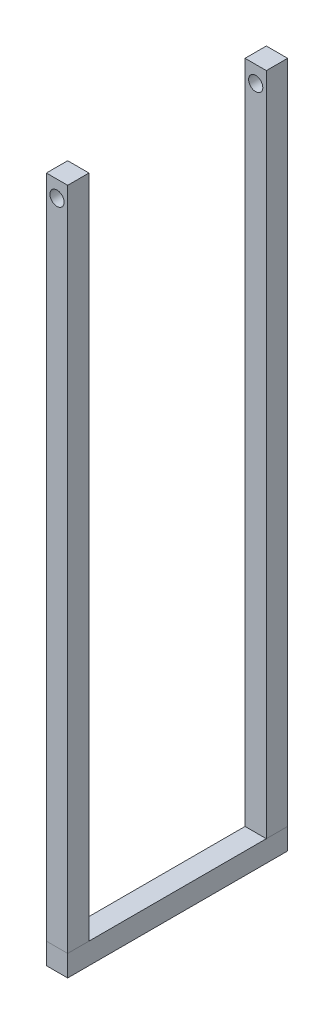
ISO-10303-21;
HEADER;
FILE_DESCRIPTION(('STEP AP214'),'2;1');
FILE_NAME('part.step','',(''),(''),'','','');
FILE_SCHEMA(('AUTOMOTIVE_DESIGN { 1 0 10303 214 1 1 1 1 }'));
ENDSEC;
DATA;
#1=APPLICATION_CONTEXT('core data for automotive mechanical design processes');
#2=APPLICATION_PROTOCOL_DEFINITION('international standard','automotive_design',2000,#1);
#3=PRODUCT_CONTEXT('',#1,'mechanical');
#4=PRODUCT('Part','Part','',(#3));
#5=PRODUCT_RELATED_PRODUCT_CATEGORY('part','',(#4));
#6=PRODUCT_DEFINITION_FORMATION('','',#4);
#7=PRODUCT_DEFINITION_CONTEXT('part definition',#1,'design');
#8=PRODUCT_DEFINITION('design','',#6,#7);
#9=PRODUCT_DEFINITION_SHAPE('','',#8);
#10=(LENGTH_UNIT() NAMED_UNIT(*) SI_UNIT(.MILLI.,.METRE.));
#11=(NAMED_UNIT(*) PLANE_ANGLE_UNIT() SI_UNIT($,.RADIAN.));
#12=(NAMED_UNIT(*) SI_UNIT($,.STERADIAN.) SOLID_ANGLE_UNIT());
#13=UNCERTAINTY_MEASURE_WITH_UNIT(LENGTH_MEASURE(1.E-05),#10,'distance_accuracy_value','');
#14=(GEOMETRIC_REPRESENTATION_CONTEXT(3) GLOBAL_UNCERTAINTY_ASSIGNED_CONTEXT((#13)) GLOBAL_UNIT_ASSIGNED_CONTEXT((#10,
#11,#12)) REPRESENTATION_CONTEXT('',''));
#15=CARTESIAN_POINT('',(0.,0.,0.));
#16=DIRECTION('',(0.,0.,1.));
#17=DIRECTION('',(1.,0.,0.));
#18=AXIS2_PLACEMENT_3D('',#15,#16,#17);
#19=CARTESIAN_POINT('',(6.,375.,118.));
#20=DIRECTION('',(-1.,0.,0.));
#21=DIRECTION('',(0.,0.,1.));
#22=AXIS2_PLACEMENT_3D('',#19,#20,#21);
#23=PLANE('',#22);
#24=DIRECTION('',(0.,0.,-1.));
#25=VECTOR('',#24,1.);
#26=CARTESIAN_POINT('',(6.,0.,118.));
#27=LINE('',#26,#25);
#28=CARTESIAN_POINT('',(6.,0.,118.));
#29=VERTEX_POINT('',#28);
#30=CARTESIAN_POINT('',(6.,0.,106.));
#31=VERTEX_POINT('',#30);
#32=EDGE_CURVE('E108',#29,#31,#27,.T.);
#33=ORIENTED_EDGE('',*,*,#32,.T.);
#34=DIRECTION('',(0.,-1.,0.));
#35=VECTOR('',#34,1.);
#36=CARTESIAN_POINT('',(6.,375.,106.));
#37=LINE('',#36,#35);
#38=CARTESIAN_POINT('',(6.,375.,106.));
#39=VERTEX_POINT('',#38);
#40=EDGE_CURVE('E12',#39,#31,#37,.T.);
#41=ORIENTED_EDGE('',*,*,#40,.F.);
#42=DIRECTION('',(0.,0.,-1.));
#43=VECTOR('',#42,1.);
#44=CARTESIAN_POINT('',(6.,375.,118.));
#45=LINE('',#44,#43);
#46=CARTESIAN_POINT('',(6.,375.,118.));
#47=VERTEX_POINT('',#46);
#48=EDGE_CURVE('E96',#47,#39,#45,.T.);
#49=ORIENTED_EDGE('',*,*,#48,.F.);
#50=DIRECTION('',(0.,-1.,0.));
#51=VECTOR('',#50,1.);
#52=CARTESIAN_POINT('',(6.,375.,118.));
#53=LINE('',#52,#51);
#54=EDGE_CURVE('E104',#47,#29,#53,.T.);
#55=ORIENTED_EDGE('',*,*,#54,.T.);
#56=EDGE_LOOP('',(#33,#41,#49,#55));
#57=FACE_BOUND('',#56,.T.);
#58=ADVANCED_FACE('F45',(#57),#23,.F.);
#59=CARTESIAN_POINT('',(6.,375.,106.));
#60=DIRECTION('',(0.,0.,1.));
#61=DIRECTION('',(1.,0.,0.));
#62=AXIS2_PLACEMENT_3D('',#59,#60,#61);
#63=PLANE('',#62);
#64=CARTESIAN_POINT('',(0.,365.684639754162,106.));
#65=DIRECTION('',(0.,0.,1.));
#66=DIRECTION('',(1.,0.,0.));
#67=AXIS2_PLACEMENT_3D('',#64,#65,#66);
#68=CIRCLE('',#67,4.00000000000001);
#69=CARTESIAN_POINT('',(4.00000000000001,365.684639754162,106.));
#70=VERTEX_POINT('',#69);
#71=EDGE_CURVE('E111',#70,#70,#68,.T.);
#72=ORIENTED_EDGE('',*,*,#71,.T.);
#73=EDGE_LOOP('',(#72));
#74=FACE_BOUND('',#73,.T.);
#75=DIRECTION('',(-1.,0.,0.));
#76=VECTOR('',#75,1.);
#77=CARTESIAN_POINT('',(6.,0.,106.));
#78=LINE('',#77,#76);
#79=CARTESIAN_POINT('',(-6.,0.,106.));
#80=VERTEX_POINT('',#79);
#81=EDGE_CURVE('E100',#31,#80,#78,.T.);
#82=ORIENTED_EDGE('',*,*,#81,.T.);
#83=DIRECTION('',(0.,-1.,0.));
#84=VECTOR('',#83,1.);
#85=CARTESIAN_POINT('',(-6.,375.,106.));
#86=LINE('',#85,#84);
#87=CARTESIAN_POINT('',(-6.,375.,106.));
#88=VERTEX_POINT('',#87);
#89=EDGE_CURVE('E53',#88,#80,#86,.T.);
#90=ORIENTED_EDGE('',*,*,#89,.F.);
#91=DIRECTION('',(-1.,0.,0.));
#92=VECTOR('',#91,1.);
#93=CARTESIAN_POINT('',(6.,375.,106.));
#94=LINE('',#93,#92);
#95=EDGE_CURVE('E91',#39,#88,#94,.T.);
#96=ORIENTED_EDGE('',*,*,#95,.F.);
#97=ORIENTED_EDGE('',*,*,#40,.T.);
#98=EDGE_LOOP('',(#82,#90,#96,#97));
#99=FACE_BOUND('',#98,.T.);
#100=ADVANCED_FACE('F99',(#74,#99),#63,.F.);
#101=CARTESIAN_POINT('',(-6.,375.,118.));
#102=DIRECTION('',(1.,0.,0.));
#103=DIRECTION('',(0.,0.,-1.));
#104=AXIS2_PLACEMENT_3D('',#101,#102,#103);
#105=PLANE('',#104);
#106=DIRECTION('',(0.,0.,1.));
#107=VECTOR('',#106,1.);
#108=CARTESIAN_POINT('',(-6.,0.,118.));
#109=LINE('',#108,#107);
#110=CARTESIAN_POINT('',(-6.,0.,118.));
#111=VERTEX_POINT('',#110);
#112=EDGE_CURVE('E78',#80,#111,#109,.T.);
#113=ORIENTED_EDGE('',*,*,#112,.T.);
#114=DIRECTION('',(0.,-1.,0.));
#115=VECTOR('',#114,1.);
#116=CARTESIAN_POINT('',(-6.,375.,118.));
#117=LINE('',#116,#115);
#118=CARTESIAN_POINT('',(-6.,375.,118.));
#119=VERTEX_POINT('',#118);
#120=EDGE_CURVE('E101',#119,#111,#117,.T.);
#121=ORIENTED_EDGE('',*,*,#120,.F.);
#122=DIRECTION('',(0.,0.,1.));
#123=VECTOR('',#122,1.);
#124=CARTESIAN_POINT('',(-6.,375.,118.));
#125=LINE('',#124,#123);
#126=EDGE_CURVE('E94',#88,#119,#125,.T.);
#127=ORIENTED_EDGE('',*,*,#126,.F.);
#128=ORIENTED_EDGE('',*,*,#89,.T.);
#129=EDGE_LOOP('',(#113,#121,#127,#128));
#130=FACE_BOUND('',#129,.T.);
#131=ADVANCED_FACE('F102',(#130),#105,.F.);
#132=CARTESIAN_POINT('',(6.,375.,118.));
#133=DIRECTION('',(0.,0.,-1.));
#134=DIRECTION('',(-1.,0.,0.));
#135=AXIS2_PLACEMENT_3D('',#132,#133,#134);
#136=PLANE('',#135);
#137=CARTESIAN_POINT('',(0.,365.684639754162,118.));
#138=DIRECTION('',(0.,0.,1.));
#139=DIRECTION('',(1.,0.,0.));
#140=AXIS2_PLACEMENT_3D('',#137,#138,#139);
#141=CIRCLE('',#140,4.00000000000001);
#142=CARTESIAN_POINT('',(4.00000000000001,365.684639754162,118.));
#143=VERTEX_POINT('',#142);
#144=EDGE_CURVE('E124',#143,#143,#141,.T.);
#145=ORIENTED_EDGE('',*,*,#144,.F.);
#146=EDGE_LOOP('',(#145));
#147=FACE_BOUND('',#146,.T.);
#148=DIRECTION('',(1.,0.,0.));
#149=VECTOR('',#148,1.);
#150=CARTESIAN_POINT('',(6.,0.,118.));
#151=LINE('',#150,#149);
#152=EDGE_CURVE('E84',#111,#29,#151,.T.);
#153=ORIENTED_EDGE('',*,*,#152,.T.);
#154=ORIENTED_EDGE('',*,*,#54,.F.);
#155=DIRECTION('',(1.,0.,0.));
#156=VECTOR('',#155,1.);
#157=CARTESIAN_POINT('',(6.,375.,118.));
#158=LINE('',#157,#156);
#159=EDGE_CURVE('E61',#119,#47,#158,.T.);
#160=ORIENTED_EDGE('',*,*,#159,.F.);
#161=ORIENTED_EDGE('',*,*,#120,.T.);
#162=EDGE_LOOP('',(#153,#154,#160,#161));
#163=FACE_BOUND('',#162,.T.);
#164=ADVANCED_FACE('F116',(#147,#163),#136,.F.);
#165=CARTESIAN_POINT('',(0.,375.,0.));
#166=DIRECTION('',(0.,1.,0.));
#167=DIRECTION('',(0.,0.,1.));
#168=AXIS2_PLACEMENT_3D('',#165,#166,#167);
#169=PLANE('',#168);
#170=ORIENTED_EDGE('',*,*,#48,.T.);
#171=ORIENTED_EDGE('',*,*,#95,.T.);
#172=ORIENTED_EDGE('',*,*,#126,.T.);
#173=ORIENTED_EDGE('',*,*,#159,.T.);
#174=EDGE_LOOP('',(#170,#171,#172,#173));
#175=FACE_BOUND('',#174,.T.);
#176=ADVANCED_FACE('F92',(#175),#169,.T.);
#177=CARTESIAN_POINT('',(0.,0.,0.));
#178=DIRECTION('',(0.,1.,0.));
#179=DIRECTION('',(0.,0.,1.));
#180=AXIS2_PLACEMENT_3D('',#177,#178,#179);
#181=PLANE('',#180);
#182=ORIENTED_EDGE('',*,*,#32,.F.);
#183=ORIENTED_EDGE('',*,*,#152,.F.);
#184=ORIENTED_EDGE('',*,*,#112,.F.);
#185=ORIENTED_EDGE('',*,*,#81,.F.);
#186=EDGE_LOOP('',(#182,#183,#184,#185));
#187=FACE_BOUND('',#186,.T.);
#188=ADVANCED_FACE('F119',(#187),#181,.F.);
#189=CARTESIAN_POINT('',(0.,365.684639754162,-6.));
#190=DIRECTION('',(0.,0.,1.));
#191=DIRECTION('',(1.,0.,0.));
#192=AXIS2_PLACEMENT_3D('',#189,#190,#191);
#193=CYLINDRICAL_SURFACE('',#192,4.00000000000001);
#194=ORIENTED_EDGE('',*,*,#144,.T.);
#195=EDGE_LOOP('',(#194));
#196=FACE_BOUND('',#195,.T.);
#197=ORIENTED_EDGE('',*,*,#71,.F.);
#198=EDGE_LOOP('',(#197));
#199=FACE_BOUND('',#198,.T.);
#200=ADVANCED_FACE('F128',(#196,#199),#193,.F.);
#201=CLOSED_SHELL('',(#58,#100,#131,#164,#176,#188,#200));
#202=MANIFOLD_SOLID_BREP('B2',#201);
#203=CARTESIAN_POINT('',(6.,0.,118.));
#204=DIRECTION('',(1.,0.,0.));
#205=DIRECTION('',(0.,1.,0.));
#206=AXIS2_PLACEMENT_3D('',#203,#204,#205);
#207=PLANE('',#206);
#208=DIRECTION('',(0.,-1.,0.));
#209=VECTOR('',#208,1.);
#210=CARTESIAN_POINT('',(6.,0.,-6.));
#211=LINE('',#210,#209);
#212=CARTESIAN_POINT('',(6.,0.,-6.));
#213=VERTEX_POINT('',#212);
#214=CARTESIAN_POINT('',(6.,-12.,-6.));
#215=VERTEX_POINT('',#214);
#216=EDGE_CURVE('E262',#213,#215,#211,.T.);
#217=ORIENTED_EDGE('',*,*,#216,.F.);
#218=DIRECTION('',(0.,0.,-1.));
#219=VECTOR('',#218,1.);
#220=CARTESIAN_POINT('',(6.,0.,118.));
#221=LINE('',#220,#219);
#222=CARTESIAN_POINT('',(6.,0.,118.));
#223=VERTEX_POINT('',#222);
#224=EDGE_CURVE('E43',#223,#213,#221,.T.);
#225=ORIENTED_EDGE('',*,*,#224,.F.);
#226=DIRECTION('',(0.,-1.,0.));
#227=VECTOR('',#226,1.);
#228=CARTESIAN_POINT('',(6.,0.,118.));
#229=LINE('',#228,#227);
#230=CARTESIAN_POINT('',(6.,-12.,118.));
#231=VERTEX_POINT('',#230);
#232=EDGE_CURVE('E256',#223,#231,#229,.T.);
#233=ORIENTED_EDGE('',*,*,#232,.T.);
#234=DIRECTION('',(0.,0.,-1.));
#235=VECTOR('',#234,1.);
#236=CARTESIAN_POINT('',(6.,-12.,118.));
#237=LINE('',#236,#235);
#238=EDGE_CURVE('E201',#231,#215,#237,.T.);
#239=ORIENTED_EDGE('',*,*,#238,.T.);
#240=EDGE_LOOP('',(#217,#225,#233,#239));
#241=FACE_BOUND('',#240,.T.);
#242=ADVANCED_FACE('F198',(#241),#207,.T.);
#243=CARTESIAN_POINT('',(6.,0.,118.));
#244=DIRECTION('',(0.,1.,0.));
#245=DIRECTION('',(0.,0.,1.));
#246=AXIS2_PLACEMENT_3D('',#243,#244,#245);
#247=PLANE('',#246);
#248=DIRECTION('',(1.,0.,0.));
#249=VECTOR('',#248,1.);
#250=CARTESIAN_POINT('',(6.,0.,-6.));
#251=LINE('',#250,#249);
#252=CARTESIAN_POINT('',(-6.,0.,-6.));
#253=VERTEX_POINT('',#252);
#254=EDGE_CURVE('E258',#253,#213,#251,.T.);
#255=ORIENTED_EDGE('',*,*,#254,.F.);
#256=DIRECTION('',(0.,0.,-1.));
#257=VECTOR('',#256,1.);
#258=CARTESIAN_POINT('',(-6.,0.,118.));
#259=LINE('',#258,#257);
#260=CARTESIAN_POINT('',(-6.,0.,118.));
#261=VERTEX_POINT('',#260);
#262=EDGE_CURVE('E207',#261,#253,#259,.T.);
#263=ORIENTED_EDGE('',*,*,#262,.F.);
#264=DIRECTION('',(1.,0.,0.));
#265=VECTOR('',#264,1.);
#266=CARTESIAN_POINT('',(6.,0.,118.));
#267=LINE('',#266,#265);
#268=EDGE_CURVE('E253',#261,#223,#267,.T.);
#269=ORIENTED_EDGE('',*,*,#268,.T.);
#270=ORIENTED_EDGE('',*,*,#224,.T.);
#271=EDGE_LOOP('',(#255,#263,#269,#270));
#272=FACE_BOUND('',#271,.T.);
#273=ADVANCED_FACE('F272',(#272),#247,.T.);
#274=CARTESIAN_POINT('',(-6.,0.,118.));
#275=DIRECTION('',(-1.,0.,0.));
#276=DIRECTION('',(0.,-1.,0.));
#277=AXIS2_PLACEMENT_3D('',#274,#275,#276);
#278=PLANE('',#277);
#279=DIRECTION('',(0.,1.,0.));
#280=VECTOR('',#279,1.);
#281=CARTESIAN_POINT('',(-6.,0.,-6.));
#282=LINE('',#281,#280);
#283=CARTESIAN_POINT('',(-6.,-12.,-6.));
#284=VERTEX_POINT('',#283);
#285=EDGE_CURVE('E248',#284,#253,#282,.T.);
#286=ORIENTED_EDGE('',*,*,#285,.F.);
#287=DIRECTION('',(0.,0.,-1.));
#288=VECTOR('',#287,1.);
#289=CARTESIAN_POINT('',(-6.,-12.,118.));
#290=LINE('',#289,#288);
#291=CARTESIAN_POINT('',(-6.,-12.,118.));
#292=VERTEX_POINT('',#291);
#293=EDGE_CURVE('E243',#292,#284,#290,.T.);
#294=ORIENTED_EDGE('',*,*,#293,.F.);
#295=DIRECTION('',(0.,1.,0.));
#296=VECTOR('',#295,1.);
#297=CARTESIAN_POINT('',(-6.,0.,118.));
#298=LINE('',#297,#296);
#299=EDGE_CURVE('E246',#292,#261,#298,.T.);
#300=ORIENTED_EDGE('',*,*,#299,.T.);
#301=ORIENTED_EDGE('',*,*,#262,.T.);
#302=EDGE_LOOP('',(#286,#294,#300,#301));
#303=FACE_BOUND('',#302,.T.);
#304=ADVANCED_FACE('F245',(#303),#278,.T.);
#305=CARTESIAN_POINT('',(6.,-12.,118.));
#306=DIRECTION('',(0.,-1.,0.));
#307=DIRECTION('',(0.,0.,-1.));
#308=AXIS2_PLACEMENT_3D('',#305,#306,#307);
#309=PLANE('',#308);
#310=DIRECTION('',(-1.,0.,0.));
#311=VECTOR('',#310,1.);
#312=CARTESIAN_POINT('',(6.,-12.,-6.));
#313=LINE('',#312,#311);
#314=EDGE_CURVE('E265',#215,#284,#313,.T.);
#315=ORIENTED_EDGE('',*,*,#314,.F.);
#316=ORIENTED_EDGE('',*,*,#238,.F.);
#317=DIRECTION('',(-1.,0.,0.));
#318=VECTOR('',#317,1.);
#319=CARTESIAN_POINT('',(6.,-12.,118.));
#320=LINE('',#319,#318);
#321=EDGE_CURVE('E252',#231,#292,#320,.T.);
#322=ORIENTED_EDGE('',*,*,#321,.T.);
#323=ORIENTED_EDGE('',*,*,#293,.T.);
#324=EDGE_LOOP('',(#315,#316,#322,#323));
#325=FACE_BOUND('',#324,.T.);
#326=ADVANCED_FACE('F255',(#325),#309,.T.);
#327=CARTESIAN_POINT('',(0.,0.,118.));
#328=DIRECTION('',(0.,0.,-1.));
#329=DIRECTION('',(-1.,0.,0.));
#330=AXIS2_PLACEMENT_3D('',#327,#328,#329);
#331=PLANE('',#330);
#332=ORIENTED_EDGE('',*,*,#232,.F.);
#333=ORIENTED_EDGE('',*,*,#268,.F.);
#334=ORIENTED_EDGE('',*,*,#299,.F.);
#335=ORIENTED_EDGE('',*,*,#321,.F.);
#336=EDGE_LOOP('',(#332,#333,#334,#335));
#337=FACE_BOUND('',#336,.T.);
#338=ADVANCED_FACE('F251',(#337),#331,.F.);
#339=CARTESIAN_POINT('',(0.,0.,-6.));
#340=DIRECTION('',(0.,0.,-1.));
#341=DIRECTION('',(-1.,0.,0.));
#342=AXIS2_PLACEMENT_3D('',#339,#340,#341);
#343=PLANE('',#342);
#344=ORIENTED_EDGE('',*,*,#216,.T.);
#345=ORIENTED_EDGE('',*,*,#314,.T.);
#346=ORIENTED_EDGE('',*,*,#285,.T.);
#347=ORIENTED_EDGE('',*,*,#254,.T.);
#348=EDGE_LOOP('',(#344,#345,#346,#347));
#349=FACE_BOUND('',#348,.T.);
#350=ADVANCED_FACE('F271',(#349),#343,.T.);
#351=CLOSED_SHELL('',(#242,#273,#304,#326,#338,#350));
#352=MANIFOLD_SOLID_BREP('B6',#351);
#353=CARTESIAN_POINT('',(6.,375.,6.));
#354=DIRECTION('',(-1.,0.,0.));
#355=DIRECTION('',(0.,0.,1.));
#356=AXIS2_PLACEMENT_3D('',#353,#354,#355);
#357=PLANE('',#356);
#358=DIRECTION('',(0.,0.,-1.));
#359=VECTOR('',#358,1.);
#360=CARTESIAN_POINT('',(6.,0.,6.));
#361=LINE('',#360,#359);
#362=CARTESIAN_POINT('',(6.,0.,6.));
#363=VERTEX_POINT('',#362);
#364=CARTESIAN_POINT('',(6.,0.,-6.));
#365=VERTEX_POINT('',#364);
#366=EDGE_CURVE('E386',#363,#365,#361,.T.);
#367=ORIENTED_EDGE('',*,*,#366,.T.);
#368=DIRECTION('',(0.,-1.,0.));
#369=VECTOR('',#368,1.);
#370=CARTESIAN_POINT('',(6.,375.,-6.));
#371=LINE('',#370,#369);
#372=CARTESIAN_POINT('',(6.,375.,-6.));
#373=VERTEX_POINT('',#372);
#374=EDGE_CURVE('E196',#373,#365,#371,.T.);
#375=ORIENTED_EDGE('',*,*,#374,.F.);
#376=DIRECTION('',(0.,0.,-1.));
#377=VECTOR('',#376,1.);
#378=CARTESIAN_POINT('',(6.,375.,6.));
#379=LINE('',#378,#377);
#380=CARTESIAN_POINT('',(6.,375.,6.));
#381=VERTEX_POINT('',#380);
#382=EDGE_CURVE('E373',#381,#373,#379,.T.);
#383=ORIENTED_EDGE('',*,*,#382,.F.);
#384=DIRECTION('',(0.,-1.,0.));
#385=VECTOR('',#384,1.);
#386=CARTESIAN_POINT('',(6.,375.,6.));
#387=LINE('',#386,#385);
#388=EDGE_CURVE('E382',#381,#363,#387,.T.);
#389=ORIENTED_EDGE('',*,*,#388,.T.);
#390=EDGE_LOOP('',(#367,#375,#383,#389));
#391=FACE_BOUND('',#390,.T.);
#392=ADVANCED_FACE('F321',(#391),#357,.F.);
#393=CARTESIAN_POINT('',(-6.,375.,-6.));
#394=DIRECTION('',(0.,0.,1.));
#395=DIRECTION('',(1.,0.,0.));
#396=AXIS2_PLACEMENT_3D('',#393,#394,#395);
#397=PLANE('',#396);
#398=CARTESIAN_POINT('',(0.,365.684639754162,-6.));
#399=DIRECTION('',(0.,0.,1.));
#400=DIRECTION('',(1.,0.,0.));
#401=AXIS2_PLACEMENT_3D('',#398,#399,#400);
#402=CIRCLE('',#401,4.00000000000001);
#403=CARTESIAN_POINT('',(4.00000000000001,365.684639754162,-6.));
#404=VERTEX_POINT('',#403);
#405=EDGE_CURVE('E399',#404,#404,#402,.T.);
#406=ORIENTED_EDGE('',*,*,#405,.T.);
#407=EDGE_LOOP('',(#406));
#408=FACE_BOUND('',#407,.T.);
#409=DIRECTION('',(-1.,0.,0.));
#410=VECTOR('',#409,1.);
#411=CARTESIAN_POINT('',(-6.,0.,-6.));
#412=LINE('',#411,#410);
#413=CARTESIAN_POINT('',(-6.,0.,-6.));
#414=VERTEX_POINT('',#413);
#415=EDGE_CURVE('E377',#365,#414,#412,.T.);
#416=ORIENTED_EDGE('',*,*,#415,.T.);
#417=DIRECTION('',(0.,-1.,0.));
#418=VECTOR('',#417,1.);
#419=CARTESIAN_POINT('',(-6.,375.,-6.));
#420=LINE('',#419,#418);
#421=CARTESIAN_POINT('',(-6.,375.,-6.));
#422=VERTEX_POINT('',#421);
#423=EDGE_CURVE('E330',#422,#414,#420,.T.);
#424=ORIENTED_EDGE('',*,*,#423,.F.);
#425=DIRECTION('',(-1.,0.,0.));
#426=VECTOR('',#425,1.);
#427=CARTESIAN_POINT('',(-6.,375.,-6.));
#428=LINE('',#427,#426);
#429=EDGE_CURVE('E368',#373,#422,#428,.T.);
#430=ORIENTED_EDGE('',*,*,#429,.F.);
#431=ORIENTED_EDGE('',*,*,#374,.T.);
#432=EDGE_LOOP('',(#416,#424,#430,#431));
#433=FACE_BOUND('',#432,.T.);
#434=ADVANCED_FACE('F376',(#408,#433),#397,.F.);
#435=CARTESIAN_POINT('',(-6.,375.,6.));
#436=DIRECTION('',(1.,0.,0.));
#437=DIRECTION('',(0.,0.,-1.));
#438=AXIS2_PLACEMENT_3D('',#435,#436,#437);
#439=PLANE('',#438);
#440=DIRECTION('',(0.,0.,1.));
#441=VECTOR('',#440,1.);
#442=CARTESIAN_POINT('',(-6.,0.,6.));
#443=LINE('',#442,#441);
#444=CARTESIAN_POINT('',(-6.,0.,6.));
#445=VERTEX_POINT('',#444);
#446=EDGE_CURVE('E355',#414,#445,#443,.T.);
#447=ORIENTED_EDGE('',*,*,#446,.T.);
#448=DIRECTION('',(0.,-1.,0.));
#449=VECTOR('',#448,1.);
#450=CARTESIAN_POINT('',(-6.,375.,6.));
#451=LINE('',#450,#449);
#452=CARTESIAN_POINT('',(-6.,375.,6.));
#453=VERTEX_POINT('',#452);
#454=EDGE_CURVE('E378',#453,#445,#451,.T.);
#455=ORIENTED_EDGE('',*,*,#454,.F.);
#456=DIRECTION('',(0.,0.,1.));
#457=VECTOR('',#456,1.);
#458=CARTESIAN_POINT('',(-6.,375.,6.));
#459=LINE('',#458,#457);
#460=EDGE_CURVE('E371',#422,#453,#459,.T.);
#461=ORIENTED_EDGE('',*,*,#460,.F.);
#462=ORIENTED_EDGE('',*,*,#423,.T.);
#463=EDGE_LOOP('',(#447,#455,#461,#462));
#464=FACE_BOUND('',#463,.T.);
#465=ADVANCED_FACE('F380',(#464),#439,.F.);
#466=CARTESIAN_POINT('',(-6.,375.,6.));
#467=DIRECTION('',(0.,0.,-1.));
#468=DIRECTION('',(-1.,0.,0.));
#469=AXIS2_PLACEMENT_3D('',#466,#467,#468);
#470=PLANE('',#469);
#471=CARTESIAN_POINT('',(0.,365.684639754162,6.));
#472=DIRECTION('',(0.,0.,-1.));
#473=DIRECTION('',(-1.,0.,0.));
#474=AXIS2_PLACEMENT_3D('',#471,#472,#473);
#475=CIRCLE('',#474,4.00000000000001);
#476=CARTESIAN_POINT('',(-4.00000000000001,365.684639754162,6.));
#477=VERTEX_POINT('',#476);
#478=EDGE_CURVE('E324',#477,#477,#475,.T.);
#479=ORIENTED_EDGE('',*,*,#478,.T.);
#480=EDGE_LOOP('',(#479));
#481=FACE_BOUND('',#480,.T.);
#482=DIRECTION('',(1.,0.,0.));
#483=VECTOR('',#482,1.);
#484=CARTESIAN_POINT('',(-6.,0.,6.));
#485=LINE('',#484,#483);
#486=EDGE_CURVE('E361',#445,#363,#485,.T.);
#487=ORIENTED_EDGE('',*,*,#486,.T.);
#488=ORIENTED_EDGE('',*,*,#388,.F.);
#489=DIRECTION('',(1.,0.,0.));
#490=VECTOR('',#489,1.);
#491=CARTESIAN_POINT('',(-6.,375.,6.));
#492=LINE('',#491,#490);
#493=EDGE_CURVE('E338',#453,#381,#492,.T.);
#494=ORIENTED_EDGE('',*,*,#493,.F.);
#495=ORIENTED_EDGE('',*,*,#454,.T.);
#496=EDGE_LOOP('',(#487,#488,#494,#495));
#497=FACE_BOUND('',#496,.T.);
#498=ADVANCED_FACE('F393',(#481,#497),#470,.F.);
#499=CARTESIAN_POINT('',(0.,375.,0.));
#500=DIRECTION('',(0.,-1.,0.));
#501=DIRECTION('',(0.,0.,-1.));
#502=AXIS2_PLACEMENT_3D('',#499,#500,#501);
#503=PLANE('',#502);
#504=ORIENTED_EDGE('',*,*,#382,.T.);
#505=ORIENTED_EDGE('',*,*,#429,.T.);
#506=ORIENTED_EDGE('',*,*,#460,.T.);
#507=ORIENTED_EDGE('',*,*,#493,.T.);
#508=EDGE_LOOP('',(#504,#505,#506,#507));
#509=FACE_BOUND('',#508,.T.);
#510=ADVANCED_FACE('F369',(#509),#503,.F.);
#511=CARTESIAN_POINT('',(0.,0.,0.));
#512=DIRECTION('',(0.,-1.,0.));
#513=DIRECTION('',(0.,0.,-1.));
#514=AXIS2_PLACEMENT_3D('',#511,#512,#513);
#515=PLANE('',#514);
#516=ORIENTED_EDGE('',*,*,#366,.F.);
#517=ORIENTED_EDGE('',*,*,#486,.F.);
#518=ORIENTED_EDGE('',*,*,#446,.F.);
#519=ORIENTED_EDGE('',*,*,#415,.F.);
#520=EDGE_LOOP('',(#516,#517,#518,#519));
#521=FACE_BOUND('',#520,.T.);
#522=ADVANCED_FACE('F396',(#521),#515,.T.);
#523=CARTESIAN_POINT('',(0.,365.684639754162,-6.));
#524=DIRECTION('',(0.,0.,1.));
#525=DIRECTION('',(1.,0.,0.));
#526=AXIS2_PLACEMENT_3D('',#523,#524,#525);
#527=CYLINDRICAL_SURFACE('',#526,4.00000000000001);
#528=ORIENTED_EDGE('',*,*,#405,.F.);
#529=EDGE_LOOP('',(#528));
#530=FACE_BOUND('',#529,.T.);
#531=ORIENTED_EDGE('',*,*,#478,.F.);
#532=EDGE_LOOP('',(#531));
#533=FACE_BOUND('',#532,.T.);
#534=ADVANCED_FACE('F407',(#530,#533),#527,.F.);
#535=CLOSED_SHELL('',(#392,#434,#465,#498,#510,#522,#534));
#536=MANIFOLD_SOLID_BREP('B37',#535);
#537=ADVANCED_BREP_SHAPE_REPRESENTATION('',(#18,#202,#352,#536),#14);
#538=SHAPE_DEFINITION_REPRESENTATION(#9,#537);
ENDSEC;
END-ISO-10303-21;
